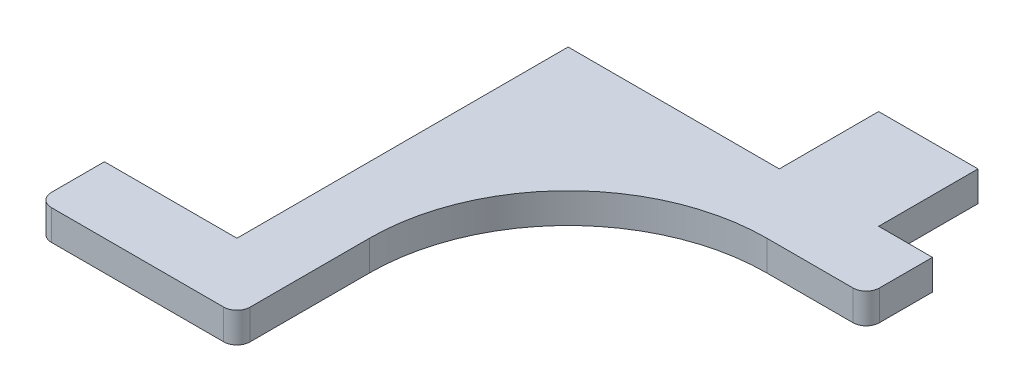
ISO-10303-21;
HEADER;
FILE_DESCRIPTION(('STEP AP214'),'2;1');
FILE_NAME('part.step','',(''),(''),'','','');
FILE_SCHEMA(('AUTOMOTIVE_DESIGN { 1 0 10303 214 1 1 1 1 }'));
ENDSEC;
DATA;
#1=APPLICATION_CONTEXT('core data for automotive mechanical design processes');
#2=APPLICATION_PROTOCOL_DEFINITION('international standard','automotive_design',2000,#1);
#3=PRODUCT_CONTEXT('',#1,'mechanical');
#4=PRODUCT('Part','Part','',(#3));
#5=PRODUCT_RELATED_PRODUCT_CATEGORY('part','',(#4));
#6=PRODUCT_DEFINITION_FORMATION('','',#4);
#7=PRODUCT_DEFINITION_CONTEXT('part definition',#1,'design');
#8=PRODUCT_DEFINITION('design','',#6,#7);
#9=PRODUCT_DEFINITION_SHAPE('','',#8);
#10=(LENGTH_UNIT() NAMED_UNIT(*) SI_UNIT(.MILLI.,.METRE.));
#11=(NAMED_UNIT(*) PLANE_ANGLE_UNIT() SI_UNIT($,.RADIAN.));
#12=(NAMED_UNIT(*) SI_UNIT($,.STERADIAN.) SOLID_ANGLE_UNIT());
#13=UNCERTAINTY_MEASURE_WITH_UNIT(LENGTH_MEASURE(1.E-05),#10,'distance_accuracy_value','');
#14=(GEOMETRIC_REPRESENTATION_CONTEXT(3) GLOBAL_UNCERTAINTY_ASSIGNED_CONTEXT((#13)) GLOBAL_UNIT_ASSIGNED_CONTEXT((#10,
#11,#12)) REPRESENTATION_CONTEXT('',''));
#15=CARTESIAN_POINT('',(0.,0.,0.));
#16=DIRECTION('',(0.,0.,1.));
#17=DIRECTION('',(1.,0.,0.));
#18=AXIS2_PLACEMENT_3D('',#15,#16,#17);
#19=CARTESIAN_POINT('',(0.,11.557,0.));
#20=DIRECTION('',(1.,0.,0.));
#21=DIRECTION('',(0.,0.,-1.));
#22=AXIS2_PLACEMENT_3D('',#19,#20,#21);
#23=PLANE('',#22);
#24=DIRECTION('',(0.,0.,1.));
#25=VECTOR('',#24,1.);
#26=CARTESIAN_POINT('',(0.,0.,0.));
#27=LINE('',#26,#25);
#28=CARTESIAN_POINT('',(0.,0.,-25.4));
#29=VERTEX_POINT('',#28);
#30=CARTESIAN_POINT('',(0.,0.,-5.08));
#31=VERTEX_POINT('',#30);
#32=EDGE_CURVE('E193',#29,#31,#27,.T.);
#33=ORIENTED_EDGE('',*,*,#32,.T.);
#34=DIRECTION('',(0.,-1.,0.));
#35=VECTOR('',#34,1.);
#36=CARTESIAN_POINT('',(0.,11.557,-5.08));
#37=LINE('',#36,#35);
#38=CARTESIAN_POINT('',(0.,11.557,-5.08));
#39=VERTEX_POINT('',#38);
#40=EDGE_CURVE('E43',#31,#39,#37,.F.);
#41=ORIENTED_EDGE('',*,*,#40,.T.);
#42=DIRECTION('',(0.,0.,1.));
#43=VECTOR('',#42,1.);
#44=CARTESIAN_POINT('',(0.,11.557,0.));
#45=LINE('',#44,#43);
#46=CARTESIAN_POINT('',(0.,11.557,-25.4));
#47=VERTEX_POINT('',#46);
#48=EDGE_CURVE('E220',#47,#39,#45,.T.);
#49=ORIENTED_EDGE('',*,*,#48,.F.);
#50=DIRECTION('',(0.,-1.,0.));
#51=VECTOR('',#50,1.);
#52=CARTESIAN_POINT('',(0.,11.557,-25.4));
#53=LINE('',#52,#51);
#54=EDGE_CURVE('E192',#47,#29,#53,.T.);
#55=ORIENTED_EDGE('',*,*,#54,.T.);
#56=EDGE_LOOP('',(#33,#41,#49,#55));
#57=FACE_BOUND('',#56,.T.);
#58=ADVANCED_FACE('F35',(#57),#23,.F.);
#59=CARTESIAN_POINT('',(0.,11.557,0.));
#60=DIRECTION('',(0.,0.,-1.));
#61=DIRECTION('',(-1.,0.,0.));
#62=AXIS2_PLACEMENT_3D('',#59,#60,#61);
#63=PLANE('',#62);
#64=DIRECTION('',(1.,0.,0.));
#65=VECTOR('',#64,1.);
#66=CARTESIAN_POINT('',(0.,11.557,0.));
#67=LINE('',#66,#65);
#68=CARTESIAN_POINT('',(5.08,11.557,0.));
#69=VERTEX_POINT('',#68);
#70=CARTESIAN_POINT('',(71.12,11.557,0.));
#71=VERTEX_POINT('',#70);
#72=EDGE_CURVE('E156',#69,#71,#67,.T.);
#73=ORIENTED_EDGE('',*,*,#72,.F.);
#74=DIRECTION('',(0.,-1.,0.));
#75=VECTOR('',#74,1.);
#76=CARTESIAN_POINT('',(5.08,11.557,0.));
#77=LINE('',#76,#75);
#78=CARTESIAN_POINT('',(5.08,0.,0.));
#79=VERTEX_POINT('',#78);
#80=EDGE_CURVE('E261',#69,#79,#77,.T.);
#81=ORIENTED_EDGE('',*,*,#80,.T.);
#82=DIRECTION('',(1.,0.,0.));
#83=VECTOR('',#82,1.);
#84=CARTESIAN_POINT('',(0.,0.,0.));
#85=LINE('',#84,#83);
#86=CARTESIAN_POINT('',(71.12,0.,0.));
#87=VERTEX_POINT('',#86);
#88=EDGE_CURVE('E196',#79,#87,#85,.T.);
#89=ORIENTED_EDGE('',*,*,#88,.T.);
#90=DIRECTION('',(0.,-1.,0.));
#91=VECTOR('',#90,1.);
#92=CARTESIAN_POINT('',(71.12,11.557,0.));
#93=LINE('',#92,#91);
#94=EDGE_CURVE('E58',#87,#71,#93,.F.);
#95=ORIENTED_EDGE('',*,*,#94,.T.);
#96=EDGE_LOOP('',(#73,#81,#89,#95));
#97=FACE_BOUND('',#96,.T.);
#98=ADVANCED_FACE('F276',(#97),#63,.F.);
#99=CARTESIAN_POINT('',(76.2,11.557,-50.8));
#100=DIRECTION('',(-1.,0.,0.));
#101=DIRECTION('',(0.,0.,1.));
#102=AXIS2_PLACEMENT_3D('',#99,#100,#101);
#103=PLANE('',#102);
#104=DIRECTION('',(0.,0.,-1.));
#105=VECTOR('',#104,1.);
#106=CARTESIAN_POINT('',(76.2,11.557,-50.8));
#107=LINE('',#106,#105);
#108=CARTESIAN_POINT('',(76.2,11.557,-5.08));
#109=VERTEX_POINT('',#108);
#110=CARTESIAN_POINT('',(76.2,11.557,-50.8));
#111=VERTEX_POINT('',#110);
#112=EDGE_CURVE('E147',#109,#111,#107,.T.);
#113=ORIENTED_EDGE('',*,*,#112,.F.);
#114=DIRECTION('',(0.,-1.,0.));
#115=VECTOR('',#114,1.);
#116=CARTESIAN_POINT('',(76.2,11.557,-5.08));
#117=LINE('',#116,#115);
#118=CARTESIAN_POINT('',(76.2,0.,-5.08));
#119=VERTEX_POINT('',#118);
#120=EDGE_CURVE('E11',#109,#119,#117,.T.);
#121=ORIENTED_EDGE('',*,*,#120,.T.);
#122=DIRECTION('',(0.,0.,-1.));
#123=VECTOR('',#122,1.);
#124=CARTESIAN_POINT('',(76.2,0.,-50.8));
#125=LINE('',#124,#123);
#126=CARTESIAN_POINT('',(76.2,0.,-50.8));
#127=VERTEX_POINT('',#126);
#128=EDGE_CURVE('E162',#119,#127,#125,.T.);
#129=ORIENTED_EDGE('',*,*,#128,.T.);
#130=DIRECTION('',(0.,-1.,0.));
#131=VECTOR('',#130,1.);
#132=CARTESIAN_POINT('',(76.2,11.557,-50.8));
#133=LINE('',#132,#131);
#134=EDGE_CURVE('E159',#111,#127,#133,.T.);
#135=ORIENTED_EDGE('',*,*,#134,.F.);
#136=EDGE_LOOP('',(#113,#121,#129,#135));
#137=FACE_BOUND('',#136,.T.);
#138=ADVANCED_FACE('F160',(#137),#103,.F.);
#139=CARTESIAN_POINT('',(152.4,11.557,-50.8));
#140=DIRECTION('',(0.,-1.,0.));
#141=DIRECTION('',(0.,0.,-1.));
#142=AXIS2_PLACEMENT_3D('',#139,#140,#141);
#143=CYLINDRICAL_SURFACE('',#142,76.2);
#144=CARTESIAN_POINT('',(152.4,0.,-50.8));
#145=DIRECTION('',(0.,-1.,0.));
#146=DIRECTION('',(0.,0.,1.));
#147=AXIS2_PLACEMENT_3D('',#144,#145,#146);
#148=CIRCLE('',#147,76.2);
#149=CARTESIAN_POINT('',(152.4,0.,-127.));
#150=VERTEX_POINT('',#149);
#151=EDGE_CURVE('E199',#127,#150,#148,.T.);
#152=ORIENTED_EDGE('',*,*,#151,.T.);
#153=DIRECTION('',(0.,-1.,0.));
#154=VECTOR('',#153,1.);
#155=CARTESIAN_POINT('',(152.4,11.557,-127.));
#156=LINE('',#155,#154);
#157=CARTESIAN_POINT('',(152.4,11.557,-127.));
#158=VERTEX_POINT('',#157);
#159=EDGE_CURVE('E166',#158,#150,#156,.T.);
#160=ORIENTED_EDGE('',*,*,#159,.F.);
#161=CARTESIAN_POINT('',(152.4,11.557,-50.8));
#162=DIRECTION('',(0.,-1.,0.));
#163=DIRECTION('',(0.,0.,1.));
#164=AXIS2_PLACEMENT_3D('',#161,#162,#163);
#165=CIRCLE('',#164,76.2);
#166=EDGE_CURVE('E152',#111,#158,#165,.T.);
#167=ORIENTED_EDGE('',*,*,#166,.F.);
#168=ORIENTED_EDGE('',*,*,#134,.T.);
#169=EDGE_LOOP('',(#152,#160,#167,#168));
#170=FACE_BOUND('',#169,.T.);
#171=ADVANCED_FACE('F168',(#170),#143,.F.);
#172=CARTESIAN_POINT('',(190.5,11.557,-127.));
#173=DIRECTION('',(0.,0.,-1.));
#174=DIRECTION('',(-1.,0.,0.));
#175=AXIS2_PLACEMENT_3D('',#172,#173,#174);
#176=PLANE('',#175);
#177=DIRECTION('',(1.,0.,0.));
#178=VECTOR('',#177,1.);
#179=CARTESIAN_POINT('',(190.5,0.,-127.));
#180=LINE('',#179,#178);
#181=CARTESIAN_POINT('',(185.42,0.,-127.));
#182=VERTEX_POINT('',#181);
#183=EDGE_CURVE('E201',#150,#182,#180,.T.);
#184=ORIENTED_EDGE('',*,*,#183,.T.);
#185=DIRECTION('',(0.,-1.,0.));
#186=VECTOR('',#185,1.);
#187=CARTESIAN_POINT('',(185.42,11.557,-127.));
#188=LINE('',#187,#186);
#189=CARTESIAN_POINT('',(185.42,11.557,-127.));
#190=VERTEX_POINT('',#189);
#191=EDGE_CURVE('E253',#182,#190,#188,.F.);
#192=ORIENTED_EDGE('',*,*,#191,.T.);
#193=DIRECTION('',(1.,0.,0.));
#194=VECTOR('',#193,1.);
#195=CARTESIAN_POINT('',(190.5,11.557,-127.));
#196=LINE('',#195,#194);
#197=EDGE_CURVE('E171',#158,#190,#196,.T.);
#198=ORIENTED_EDGE('',*,*,#197,.F.);
#199=ORIENTED_EDGE('',*,*,#159,.T.);
#200=EDGE_LOOP('',(#184,#192,#198,#199));
#201=FACE_BOUND('',#200,.T.);
#202=ADVANCED_FACE('F342',(#201),#176,.F.);
#203=CARTESIAN_POINT('',(190.5,11.557,-152.4));
#204=DIRECTION('',(-1.,0.,0.));
#205=DIRECTION('',(0.,0.,1.));
#206=AXIS2_PLACEMENT_3D('',#203,#204,#205);
#207=PLANE('',#206);
#208=DIRECTION('',(0.,0.,-1.));
#209=VECTOR('',#208,1.);
#210=CARTESIAN_POINT('',(190.5,11.557,-152.4));
#211=LINE('',#210,#209);
#212=CARTESIAN_POINT('',(190.5,11.557,-132.08));
#213=VERTEX_POINT('',#212);
#214=CARTESIAN_POINT('',(190.5,11.557,-152.4));
#215=VERTEX_POINT('',#214);
#216=EDGE_CURVE('E173',#213,#215,#211,.T.);
#217=ORIENTED_EDGE('',*,*,#216,.F.);
#218=DIRECTION('',(0.,-1.,0.));
#219=VECTOR('',#218,1.);
#220=CARTESIAN_POINT('',(190.5,11.557,-132.08));
#221=LINE('',#220,#219);
#222=CARTESIAN_POINT('',(190.5,0.,-132.08));
#223=VERTEX_POINT('',#222);
#224=EDGE_CURVE('E165',#213,#223,#221,.T.);
#225=ORIENTED_EDGE('',*,*,#224,.T.);
#226=DIRECTION('',(0.,0.,-1.));
#227=VECTOR('',#226,1.);
#228=CARTESIAN_POINT('',(190.5,0.,-152.4));
#229=LINE('',#228,#227);
#230=CARTESIAN_POINT('',(190.5,0.,-152.4));
#231=VERTEX_POINT('',#230);
#232=EDGE_CURVE('E204',#223,#231,#229,.T.);
#233=ORIENTED_EDGE('',*,*,#232,.T.);
#234=DIRECTION('',(0.,-1.,0.));
#235=VECTOR('',#234,1.);
#236=CARTESIAN_POINT('',(190.5,11.557,-152.4));
#237=LINE('',#236,#235);
#238=EDGE_CURVE('E241',#215,#231,#237,.T.);
#239=ORIENTED_EDGE('',*,*,#238,.F.);
#240=EDGE_LOOP('',(#217,#225,#233,#239));
#241=FACE_BOUND('',#240,.T.);
#242=ADVANCED_FACE('F306',(#241),#207,.F.);
#243=CARTESIAN_POINT('',(169.8625,11.557,-152.4));
#244=DIRECTION('',(0.,0.,1.));
#245=DIRECTION('',(1.,0.,0.));
#246=AXIS2_PLACEMENT_3D('',#243,#244,#245);
#247=PLANE('',#246);
#248=DIRECTION('',(-1.,0.,0.));
#249=VECTOR('',#248,1.);
#250=CARTESIAN_POINT('',(169.8625,0.,-152.4));
#251=LINE('',#250,#249);
#252=CARTESIAN_POINT('',(169.8625,0.,-152.4));
#253=VERTEX_POINT('',#252);
#254=EDGE_CURVE('E206',#231,#253,#251,.T.);
#255=ORIENTED_EDGE('',*,*,#254,.T.);
#256=DIRECTION('',(0.,-1.,0.));
#257=VECTOR('',#256,1.);
#258=CARTESIAN_POINT('',(169.8625,11.557,-152.4));
#259=LINE('',#258,#257);
#260=CARTESIAN_POINT('',(169.8625,11.557,-152.4));
#261=VERTEX_POINT('',#260);
#262=EDGE_CURVE('E238',#261,#253,#259,.T.);
#263=ORIENTED_EDGE('',*,*,#262,.F.);
#264=DIRECTION('',(-1.,0.,0.));
#265=VECTOR('',#264,1.);
#266=CARTESIAN_POINT('',(169.8625,11.557,-152.4));
#267=LINE('',#266,#265);
#268=EDGE_CURVE('E178',#215,#261,#267,.T.);
#269=ORIENTED_EDGE('',*,*,#268,.F.);
#270=ORIENTED_EDGE('',*,*,#238,.T.);
#271=EDGE_LOOP('',(#255,#263,#269,#270));
#272=FACE_BOUND('',#271,.T.);
#273=ADVANCED_FACE('F311',(#272),#247,.F.);
#274=CARTESIAN_POINT('',(169.8625,11.557,-190.5));
#275=DIRECTION('',(-1.,0.,0.));
#276=DIRECTION('',(0.,0.,1.));
#277=AXIS2_PLACEMENT_3D('',#274,#275,#276);
#278=PLANE('',#277);
#279=DIRECTION('',(0.,0.,-1.));
#280=VECTOR('',#279,1.);
#281=CARTESIAN_POINT('',(169.8625,0.,-190.5));
#282=LINE('',#281,#280);
#283=CARTESIAN_POINT('',(169.8625,0.,-190.5));
#284=VERTEX_POINT('',#283);
#285=EDGE_CURVE('E208',#253,#284,#282,.T.);
#286=ORIENTED_EDGE('',*,*,#285,.T.);
#287=DIRECTION('',(0.,-1.,0.));
#288=VECTOR('',#287,1.);
#289=CARTESIAN_POINT('',(169.8625,11.557,-190.5));
#290=LINE('',#289,#288);
#291=CARTESIAN_POINT('',(169.8625,11.557,-190.5));
#292=VERTEX_POINT('',#291);
#293=EDGE_CURVE('E235',#292,#284,#290,.T.);
#294=ORIENTED_EDGE('',*,*,#293,.F.);
#295=DIRECTION('',(0.,0.,-1.));
#296=VECTOR('',#295,1.);
#297=CARTESIAN_POINT('',(169.8625,11.557,-190.5));
#298=LINE('',#297,#296);
#299=EDGE_CURVE('E180',#261,#292,#298,.T.);
#300=ORIENTED_EDGE('',*,*,#299,.F.);
#301=ORIENTED_EDGE('',*,*,#262,.T.);
#302=EDGE_LOOP('',(#286,#294,#300,#301));
#303=FACE_BOUND('',#302,.T.);
#304=ADVANCED_FACE('F317',(#303),#278,.F.);
#305=CARTESIAN_POINT('',(131.7625,11.557,-190.5));
#306=DIRECTION('',(0.,0.,1.));
#307=DIRECTION('',(1.,0.,0.));
#308=AXIS2_PLACEMENT_3D('',#305,#306,#307);
#309=PLANE('',#308);
#310=DIRECTION('',(-1.,0.,0.));
#311=VECTOR('',#310,1.);
#312=CARTESIAN_POINT('',(131.7625,0.,-190.5));
#313=LINE('',#312,#311);
#314=CARTESIAN_POINT('',(131.7625,0.,-190.5));
#315=VERTEX_POINT('',#314);
#316=EDGE_CURVE('E210',#284,#315,#313,.T.);
#317=ORIENTED_EDGE('',*,*,#316,.T.);
#318=DIRECTION('',(0.,-1.,0.));
#319=VECTOR('',#318,1.);
#320=CARTESIAN_POINT('',(131.7625,11.557,-190.5));
#321=LINE('',#320,#319);
#322=CARTESIAN_POINT('',(131.7625,11.557,-190.5));
#323=VERTEX_POINT('',#322);
#324=EDGE_CURVE('E232',#323,#315,#321,.T.);
#325=ORIENTED_EDGE('',*,*,#324,.F.);
#326=DIRECTION('',(-1.,0.,0.));
#327=VECTOR('',#326,1.);
#328=CARTESIAN_POINT('',(131.7625,11.557,-190.5));
#329=LINE('',#328,#327);
#330=EDGE_CURVE('E182',#292,#323,#329,.T.);
#331=ORIENTED_EDGE('',*,*,#330,.F.);
#332=ORIENTED_EDGE('',*,*,#293,.T.);
#333=EDGE_LOOP('',(#317,#325,#331,#332));
#334=FACE_BOUND('',#333,.T.);
#335=ADVANCED_FACE('F321',(#334),#309,.F.);
#336=CARTESIAN_POINT('',(131.7625,11.557,-152.4));
#337=DIRECTION('',(1.,0.,0.));
#338=DIRECTION('',(0.,0.,-1.));
#339=AXIS2_PLACEMENT_3D('',#336,#337,#338);
#340=PLANE('',#339);
#341=DIRECTION('',(0.,0.,1.));
#342=VECTOR('',#341,1.);
#343=CARTESIAN_POINT('',(131.7625,0.,-152.4));
#344=LINE('',#343,#342);
#345=CARTESIAN_POINT('',(131.7625,0.,-152.4));
#346=VERTEX_POINT('',#345);
#347=EDGE_CURVE('E212',#315,#346,#344,.T.);
#348=ORIENTED_EDGE('',*,*,#347,.T.);
#349=DIRECTION('',(0.,-1.,0.));
#350=VECTOR('',#349,1.);
#351=CARTESIAN_POINT('',(131.7625,11.557,-152.4));
#352=LINE('',#351,#350);
#353=CARTESIAN_POINT('',(131.7625,11.557,-152.4));
#354=VERTEX_POINT('',#353);
#355=EDGE_CURVE('E229',#354,#346,#352,.T.);
#356=ORIENTED_EDGE('',*,*,#355,.F.);
#357=DIRECTION('',(0.,0.,1.));
#358=VECTOR('',#357,1.);
#359=CARTESIAN_POINT('',(131.7625,11.557,-152.4));
#360=LINE('',#359,#358);
#361=EDGE_CURVE('E184',#323,#354,#360,.T.);
#362=ORIENTED_EDGE('',*,*,#361,.F.);
#363=ORIENTED_EDGE('',*,*,#324,.T.);
#364=EDGE_LOOP('',(#348,#356,#362,#363));
#365=FACE_BOUND('',#364,.T.);
#366=ADVANCED_FACE('F326',(#365),#340,.F.);
#367=CARTESIAN_POINT('',(50.8,11.557,-152.4));
#368=DIRECTION('',(0.,0.,1.));
#369=DIRECTION('',(1.,0.,0.));
#370=AXIS2_PLACEMENT_3D('',#367,#368,#369);
#371=PLANE('',#370);
#372=DIRECTION('',(-1.,0.,0.));
#373=VECTOR('',#372,1.);
#374=CARTESIAN_POINT('',(50.8,0.,-152.4));
#375=LINE('',#374,#373);
#376=CARTESIAN_POINT('',(50.8,0.,-152.4));
#377=VERTEX_POINT('',#376);
#378=EDGE_CURVE('E214',#346,#377,#375,.T.);
#379=ORIENTED_EDGE('',*,*,#378,.T.);
#380=DIRECTION('',(0.,-1.,0.));
#381=VECTOR('',#380,1.);
#382=CARTESIAN_POINT('',(50.8,11.557,-152.4));
#383=LINE('',#382,#381);
#384=CARTESIAN_POINT('',(50.8,11.557,-152.4));
#385=VERTEX_POINT('',#384);
#386=EDGE_CURVE('E226',#385,#377,#383,.T.);
#387=ORIENTED_EDGE('',*,*,#386,.F.);
#388=DIRECTION('',(-1.,0.,0.));
#389=VECTOR('',#388,1.);
#390=CARTESIAN_POINT('',(50.8,11.557,-152.4));
#391=LINE('',#390,#389);
#392=EDGE_CURVE('E186',#354,#385,#391,.T.);
#393=ORIENTED_EDGE('',*,*,#392,.F.);
#394=ORIENTED_EDGE('',*,*,#355,.T.);
#395=EDGE_LOOP('',(#379,#387,#393,#394));
#396=FACE_BOUND('',#395,.T.);
#397=ADVANCED_FACE('F332',(#396),#371,.F.);
#398=CARTESIAN_POINT('',(50.8,11.557,-25.4));
#399=DIRECTION('',(1.,0.,0.));
#400=DIRECTION('',(0.,0.,-1.));
#401=AXIS2_PLACEMENT_3D('',#398,#399,#400);
#402=PLANE('',#401);
#403=DIRECTION('',(0.,0.,1.));
#404=VECTOR('',#403,1.);
#405=CARTESIAN_POINT('',(50.8,0.,-25.4));
#406=LINE('',#405,#404);
#407=CARTESIAN_POINT('',(50.8,0.,-25.4));
#408=VERTEX_POINT('',#407);
#409=EDGE_CURVE('E216',#377,#408,#406,.T.);
#410=ORIENTED_EDGE('',*,*,#409,.T.);
#411=DIRECTION('',(0.,-1.,0.));
#412=VECTOR('',#411,1.);
#413=CARTESIAN_POINT('',(50.8,11.557,-25.4));
#414=LINE('',#413,#412);
#415=CARTESIAN_POINT('',(50.8,11.557,-25.4));
#416=VERTEX_POINT('',#415);
#417=EDGE_CURVE('E223',#416,#408,#414,.T.);
#418=ORIENTED_EDGE('',*,*,#417,.F.);
#419=DIRECTION('',(0.,0.,1.));
#420=VECTOR('',#419,1.);
#421=CARTESIAN_POINT('',(50.8,11.557,-25.4));
#422=LINE('',#421,#420);
#423=EDGE_CURVE('E188',#385,#416,#422,.T.);
#424=ORIENTED_EDGE('',*,*,#423,.F.);
#425=ORIENTED_EDGE('',*,*,#386,.T.);
#426=EDGE_LOOP('',(#410,#418,#424,#425));
#427=FACE_BOUND('',#426,.T.);
#428=ADVANCED_FACE('F336',(#427),#402,.F.);
#429=CARTESIAN_POINT('',(0.,11.557,-25.4));
#430=DIRECTION('',(0.,0.,1.));
#431=DIRECTION('',(1.,0.,0.));
#432=AXIS2_PLACEMENT_3D('',#429,#430,#431);
#433=PLANE('',#432);
#434=DIRECTION('',(-1.,0.,0.));
#435=VECTOR('',#434,1.);
#436=CARTESIAN_POINT('',(0.,0.,-25.4));
#437=LINE('',#436,#435);
#438=EDGE_CURVE('E218',#408,#29,#437,.T.);
#439=ORIENTED_EDGE('',*,*,#438,.T.);
#440=ORIENTED_EDGE('',*,*,#54,.F.);
#441=DIRECTION('',(-1.,0.,0.));
#442=VECTOR('',#441,1.);
#443=CARTESIAN_POINT('',(0.,11.557,-25.4));
#444=LINE('',#443,#442);
#445=EDGE_CURVE('E190',#416,#47,#444,.T.);
#446=ORIENTED_EDGE('',*,*,#445,.F.);
#447=ORIENTED_EDGE('',*,*,#417,.T.);
#448=EDGE_LOOP('',(#439,#440,#446,#447));
#449=FACE_BOUND('',#448,.T.);
#450=ADVANCED_FACE('F339',(#449),#433,.F.);
#451=CARTESIAN_POINT('',(152.4,11.557,-50.8));
#452=DIRECTION('',(0.,1.,0.));
#453=DIRECTION('',(0.,0.,1.));
#454=AXIS2_PLACEMENT_3D('',#451,#452,#453);
#455=PLANE('',#454);
#456=ORIENTED_EDGE('',*,*,#197,.T.);
#457=CARTESIAN_POINT('',(185.42,11.557,-132.08));
#458=DIRECTION('',(0.,1.,0.));
#459=DIRECTION('',(0.,0.,1.));
#460=AXIS2_PLACEMENT_3D('',#457,#458,#459);
#461=CIRCLE('',#460,5.08);
#462=EDGE_CURVE('E258',#190,#213,#461,.T.);
#463=ORIENTED_EDGE('',*,*,#462,.T.);
#464=ORIENTED_EDGE('',*,*,#216,.T.);
#465=ORIENTED_EDGE('',*,*,#268,.T.);
#466=ORIENTED_EDGE('',*,*,#299,.T.);
#467=ORIENTED_EDGE('',*,*,#330,.T.);
#468=ORIENTED_EDGE('',*,*,#361,.T.);
#469=ORIENTED_EDGE('',*,*,#392,.T.);
#470=ORIENTED_EDGE('',*,*,#423,.T.);
#471=ORIENTED_EDGE('',*,*,#445,.T.);
#472=ORIENTED_EDGE('',*,*,#48,.T.);
#473=CARTESIAN_POINT('',(5.08,11.557,-5.08));
#474=DIRECTION('',(0.,1.,0.));
#475=DIRECTION('',(0.,0.,1.));
#476=AXIS2_PLACEMENT_3D('',#473,#474,#475);
#477=CIRCLE('',#476,5.08);
#478=EDGE_CURVE('E256',#39,#69,#477,.T.);
#479=ORIENTED_EDGE('',*,*,#478,.T.);
#480=ORIENTED_EDGE('',*,*,#72,.T.);
#481=CARTESIAN_POINT('',(71.12,11.557,-5.08));
#482=DIRECTION('',(0.,1.,0.));
#483=DIRECTION('',(0.,0.,1.));
#484=AXIS2_PLACEMENT_3D('',#481,#482,#483);
#485=CIRCLE('',#484,5.08);
#486=EDGE_CURVE('E50',#71,#109,#485,.T.);
#487=ORIENTED_EDGE('',*,*,#486,.T.);
#488=ORIENTED_EDGE('',*,*,#112,.T.);
#489=ORIENTED_EDGE('',*,*,#166,.T.);
#490=EDGE_LOOP('',(#456,#463,#464,#465,#466,#467,#468,#469,#470,#471,#472,#479,#480,#487,#488,#489));
#491=FACE_BOUND('',#490,.T.);
#492=ADVANCED_FACE('F150',(#491),#455,.T.);
#493=CARTESIAN_POINT('',(152.4,0.,-50.8));
#494=DIRECTION('',(0.,1.,0.));
#495=DIRECTION('',(0.,0.,1.));
#496=AXIS2_PLACEMENT_3D('',#493,#494,#495);
#497=PLANE('',#496);
#498=ORIENTED_EDGE('',*,*,#232,.F.);
#499=CARTESIAN_POINT('',(185.42,0.,-132.08));
#500=DIRECTION('',(0.,1.,0.));
#501=DIRECTION('',(0.,0.,1.));
#502=AXIS2_PLACEMENT_3D('',#499,#500,#501);
#503=CIRCLE('',#502,5.08);
#504=EDGE_CURVE('E251',#223,#182,#503,.F.);
#505=ORIENTED_EDGE('',*,*,#504,.T.);
#506=ORIENTED_EDGE('',*,*,#183,.F.);
#507=ORIENTED_EDGE('',*,*,#151,.F.);
#508=ORIENTED_EDGE('',*,*,#128,.F.);
#509=CARTESIAN_POINT('',(71.12,0.,-5.08));
#510=DIRECTION('',(0.,1.,0.));
#511=DIRECTION('',(0.,0.,1.));
#512=AXIS2_PLACEMENT_3D('',#509,#510,#511);
#513=CIRCLE('',#512,5.08);
#514=EDGE_CURVE('E247',#119,#87,#513,.F.);
#515=ORIENTED_EDGE('',*,*,#514,.T.);
#516=ORIENTED_EDGE('',*,*,#88,.F.);
#517=CARTESIAN_POINT('',(5.08,0.,-5.08));
#518=DIRECTION('',(0.,1.,0.));
#519=DIRECTION('',(0.,0.,1.));
#520=AXIS2_PLACEMENT_3D('',#517,#518,#519);
#521=CIRCLE('',#520,5.08);
#522=EDGE_CURVE('E249',#79,#31,#521,.F.);
#523=ORIENTED_EDGE('',*,*,#522,.T.);
#524=ORIENTED_EDGE('',*,*,#32,.F.);
#525=ORIENTED_EDGE('',*,*,#438,.F.);
#526=ORIENTED_EDGE('',*,*,#409,.F.);
#527=ORIENTED_EDGE('',*,*,#378,.F.);
#528=ORIENTED_EDGE('',*,*,#347,.F.);
#529=ORIENTED_EDGE('',*,*,#316,.F.);
#530=ORIENTED_EDGE('',*,*,#285,.F.);
#531=ORIENTED_EDGE('',*,*,#254,.F.);
#532=EDGE_LOOP('',(#498,#505,#506,#507,#508,#515,#516,#523,#524,#525,#526,#527,#528,#529,#530,#531));
#533=FACE_BOUND('',#532,.T.);
#534=ADVANCED_FACE('F279',(#533),#497,.F.);
#535=CARTESIAN_POINT('',(185.42,11.557,-132.08));
#536=DIRECTION('',(0.,-1.,0.));
#537=DIRECTION('',(0.,0.,-1.));
#538=AXIS2_PLACEMENT_3D('',#535,#536,#537);
#539=CYLINDRICAL_SURFACE('',#538,5.08);
#540=ORIENTED_EDGE('',*,*,#462,.F.);
#541=ORIENTED_EDGE('',*,*,#191,.F.);
#542=ORIENTED_EDGE('',*,*,#504,.F.);
#543=ORIENTED_EDGE('',*,*,#224,.F.);
#544=EDGE_LOOP('',(#540,#541,#542,#543));
#545=FACE_BOUND('',#544,.T.);
#546=ADVANCED_FACE('F285',(#545),#539,.T.);
#547=CARTESIAN_POINT('',(5.08,11.557,-5.08));
#548=DIRECTION('',(0.,-1.,0.));
#549=DIRECTION('',(0.,0.,-1.));
#550=AXIS2_PLACEMENT_3D('',#547,#548,#549);
#551=CYLINDRICAL_SURFACE('',#550,5.08);
#552=ORIENTED_EDGE('',*,*,#478,.F.);
#553=ORIENTED_EDGE('',*,*,#40,.F.);
#554=ORIENTED_EDGE('',*,*,#522,.F.);
#555=ORIENTED_EDGE('',*,*,#80,.F.);
#556=EDGE_LOOP('',(#552,#553,#554,#555));
#557=FACE_BOUND('',#556,.T.);
#558=ADVANCED_FACE('F274',(#557),#551,.T.);
#559=CARTESIAN_POINT('',(71.12,11.557,-5.08));
#560=DIRECTION('',(0.,-1.,0.));
#561=DIRECTION('',(0.,0.,-1.));
#562=AXIS2_PLACEMENT_3D('',#559,#560,#561);
#563=CYLINDRICAL_SURFACE('',#562,5.08);
#564=ORIENTED_EDGE('',*,*,#486,.F.);
#565=ORIENTED_EDGE('',*,*,#94,.F.);
#566=ORIENTED_EDGE('',*,*,#514,.F.);
#567=ORIENTED_EDGE('',*,*,#120,.F.);
#568=EDGE_LOOP('',(#564,#565,#566,#567));
#569=FACE_BOUND('',#568,.T.);
#570=ADVANCED_FACE('F37',(#569),#563,.T.);
#571=CLOSED_SHELL('',(#58,#98,#138,#171,#202,#242,#273,#304,#335,#366,#397,#428,#450,#492,#534,
#546,#558,#570));
#572=MANIFOLD_SOLID_BREP('B2',#571);
#573=ADVANCED_BREP_SHAPE_REPRESENTATION('',(#18,#572),#14);
#574=SHAPE_DEFINITION_REPRESENTATION(#9,#573);
ENDSEC;
END-ISO-10303-21;
